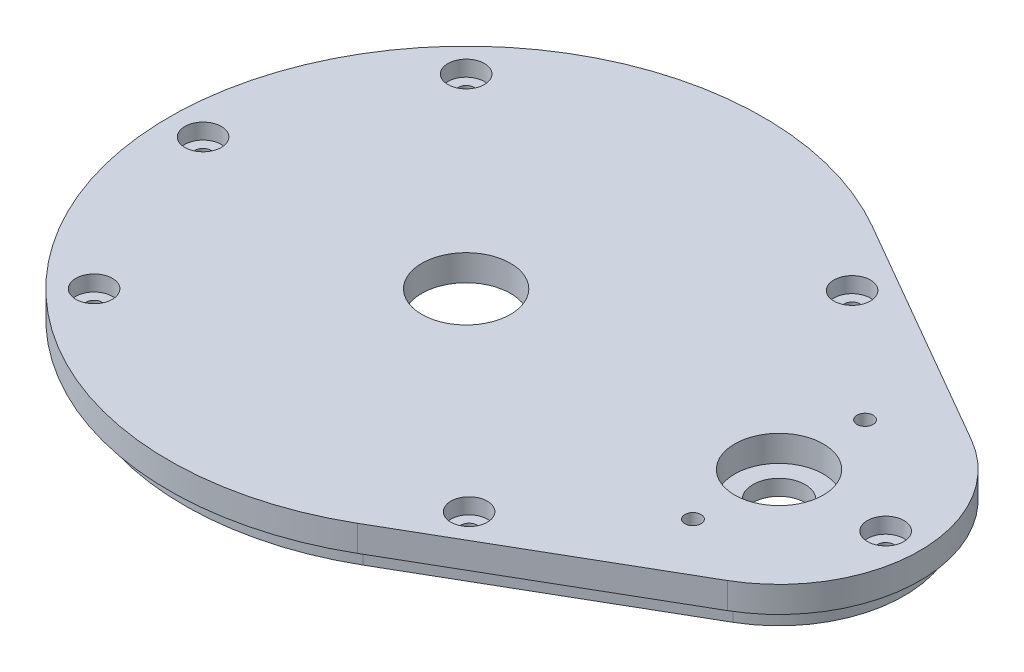
ISO-10303-21;
HEADER;
FILE_DESCRIPTION(('STEP AP214'),'2;1');
FILE_NAME('part.step','',(''),(''),'','','');
FILE_SCHEMA(('AUTOMOTIVE_DESIGN { 1 0 10303 214 1 1 1 1 }'));
ENDSEC;
DATA;
#1=APPLICATION_CONTEXT('core data for automotive mechanical design processes');
#2=APPLICATION_PROTOCOL_DEFINITION('international standard','automotive_design',2000,#1);
#3=PRODUCT_CONTEXT('',#1,'mechanical');
#4=PRODUCT('Part','Part','',(#3));
#5=PRODUCT_RELATED_PRODUCT_CATEGORY('part','',(#4));
#6=PRODUCT_DEFINITION_FORMATION('','',#4);
#7=PRODUCT_DEFINITION_CONTEXT('part definition',#1,'design');
#8=PRODUCT_DEFINITION('design','',#6,#7);
#9=PRODUCT_DEFINITION_SHAPE('','',#8);
#10=(LENGTH_UNIT() NAMED_UNIT(*) SI_UNIT(.MILLI.,.METRE.));
#11=(NAMED_UNIT(*) PLANE_ANGLE_UNIT() SI_UNIT($,.RADIAN.));
#12=(NAMED_UNIT(*) SI_UNIT($,.STERADIAN.) SOLID_ANGLE_UNIT());
#13=UNCERTAINTY_MEASURE_WITH_UNIT(LENGTH_MEASURE(1.E-05),#10,'distance_accuracy_value','');
#14=(GEOMETRIC_REPRESENTATION_CONTEXT(3) GLOBAL_UNCERTAINTY_ASSIGNED_CONTEXT((#13)) GLOBAL_UNIT_ASSIGNED_CONTEXT((#10,
#11,#12)) REPRESENTATION_CONTEXT('',''));
#15=CARTESIAN_POINT('',(0.,0.,0.));
#16=DIRECTION('',(0.,0.,1.));
#17=DIRECTION('',(1.,0.,0.));
#18=AXIS2_PLACEMENT_3D('',#15,#16,#17);
#19=CARTESIAN_POINT('',(22.2847401814526,0.,-36.7283111091591));
#20=DIRECTION('',(0.,1.,0.));
#21=DIRECTION('',(0.,0.,1.));
#22=AXIS2_PLACEMENT_3D('',#19,#20,#21);
#23=CYLINDRICAL_SURFACE('',#22,1.55);
#24=CARTESIAN_POINT('',(22.2847401814526,0.,-36.7283111091591));
#25=DIRECTION('',(0.,-1.,0.));
#26=DIRECTION('',(0.495533960302209,0.,-0.868588564388922));
#27=AXIS2_PLACEMENT_3D('',#24,#25,#26);
#28=CIRCLE('',#27,1.55);
#29=CARTESIAN_POINT('',(23.052817819921,0.,-38.074623383962));
#30=VERTEX_POINT('',#29);
#31=CARTESIAN_POINT('',(23.0666419936245,0.,-38.066641993553));
#32=VERTEX_POINT('',#31);
#33=EDGE_CURVE('E145',#30,#32,#28,.T.);
#34=ORIENTED_EDGE('',*,*,#33,.T.);
#35=CARTESIAN_POINT('',(22.2847401814526,0.,-36.7283111091591));
#36=DIRECTION('',(0.,1.,0.));
#37=DIRECTION('',(0.,0.,1.));
#38=AXIS2_PLACEMENT_3D('',#35,#36,#37);
#39=CIRCLE('',#38,1.55);
#40=EDGE_CURVE('E149',#30,#32,#39,.T.);
#41=ORIENTED_EDGE('',*,*,#40,.F.);
#42=EDGE_LOOP('',(#34,#41));
#43=FACE_BOUND('',#42,.T.);
#44=CARTESIAN_POINT('',(22.2847401814526,2.,-36.7283111091591));
#45=DIRECTION('',(0.,1.,0.));
#46=DIRECTION('',(0.,0.,1.));
#47=AXIS2_PLACEMENT_3D('',#44,#45,#46);
#48=CIRCLE('',#47,1.55);
#49=CARTESIAN_POINT('',(22.2847401814526,2.,-35.1783111091592));
#50=VERTEX_POINT('',#49);
#51=EDGE_CURVE('E40',#50,#50,#48,.F.);
#52=ORIENTED_EDGE('',*,*,#51,.F.);
#53=EDGE_LOOP('',(#52));
#54=FACE_BOUND('',#53,.T.);
#55=ADVANCED_FACE('F36',(#43,#54),#23,.F.);
#56=CARTESIAN_POINT('',(65.4499999999117,0.,0.));
#57=DIRECTION('',(0.,1.,0.));
#58=DIRECTION('',(0.,0.,1.));
#59=AXIS2_PLACEMENT_3D('',#56,#57,#58);
#60=CYLINDRICAL_SURFACE('',#59,1.55000000006846);
#61=CARTESIAN_POINT('',(65.4499999999117,0.,0.));
#62=DIRECTION('',(0.,1.,0.));
#63=DIRECTION('',(0.,0.,1.));
#64=AXIS2_PLACEMENT_3D('',#61,#62,#63);
#65=CIRCLE('',#64,1.55000000006846);
#66=CARTESIAN_POINT('',(66.9999999999117,0.,-6.12727402448547E-13));
#67=VERTEX_POINT('',#66);
#68=EDGE_CURVE('E432',#67,#67,#65,.T.);
#69=ORIENTED_EDGE('',*,*,#68,.F.);
#70=EDGE_LOOP('',(#69));
#71=FACE_BOUND('',#70,.T.);
#72=CARTESIAN_POINT('',(65.4499999999117,2.,0.));
#73=DIRECTION('',(0.,1.,0.));
#74=DIRECTION('',(0.,0.,1.));
#75=AXIS2_PLACEMENT_3D('',#72,#73,#74);
#76=CIRCLE('',#75,1.55000000006846);
#77=CARTESIAN_POINT('',(65.4499999999117,2.,1.55000000006846));
#78=VERTEX_POINT('',#77);
#79=EDGE_CURVE('E446',#78,#78,#76,.F.);
#80=ORIENTED_EDGE('',*,*,#79,.F.);
#81=EDGE_LOOP('',(#80));
#82=FACE_BOUND('',#81,.T.);
#83=ADVANCED_FACE('F391',(#71,#82),#60,.F.);
#84=CARTESIAN_POINT('',(-50.6735371108547,0.,35.6735371108691));
#85=DIRECTION('',(0.,1.,0.));
#86=DIRECTION('',(0.,0.,1.));
#87=AXIS2_PLACEMENT_3D('',#84,#85,#86);
#88=CYLINDRICAL_SURFACE('',#87,1.55);
#89=CARTESIAN_POINT('',(-50.6735371108547,0.,35.6735371108691));
#90=DIRECTION('',(0.,1.,0.));
#91=DIRECTION('',(0.,0.,1.));
#92=AXIS2_PLACEMENT_3D('',#89,#90,#91);
#93=CIRCLE('',#92,1.55);
#94=CARTESIAN_POINT('',(-51.7695526216938,0.,36.7695526217082));
#95=VERTEX_POINT('',#94);
#96=EDGE_CURVE('E165',#95,#95,#93,.T.);
#97=ORIENTED_EDGE('',*,*,#96,.F.);
#98=EDGE_LOOP('',(#97));
#99=FACE_BOUND('',#98,.T.);
#100=CARTESIAN_POINT('',(-50.6735371108547,2.,35.6735371108691));
#101=DIRECTION('',(0.,1.,0.));
#102=DIRECTION('',(0.,0.,1.));
#103=AXIS2_PLACEMENT_3D('',#100,#101,#102);
#104=CIRCLE('',#103,1.55);
#105=CARTESIAN_POINT('',(-50.6735371108547,2.,37.2235371108691));
#106=VERTEX_POINT('',#105);
#107=EDGE_CURVE('E450',#106,#106,#104,.F.);
#108=ORIENTED_EDGE('',*,*,#107,.F.);
#109=EDGE_LOOP('',(#108));
#110=FACE_BOUND('',#109,.T.);
#111=ADVANCED_FACE('F396',(#99,#110),#88,.F.);
#112=CARTESIAN_POINT('',(-50.6735371108711,0.,-35.6735371108371));
#113=DIRECTION('',(0.,1.,0.));
#114=DIRECTION('',(0.,0.,1.));
#115=AXIS2_PLACEMENT_3D('',#112,#113,#114);
#116=CYLINDRICAL_SURFACE('',#115,1.55);
#117=CARTESIAN_POINT('',(-50.6735371108711,0.,-35.6735371108371));
#118=DIRECTION('',(0.,1.,0.));
#119=DIRECTION('',(0.,0.,1.));
#120=AXIS2_PLACEMENT_3D('',#117,#118,#119);
#121=CIRCLE('',#120,1.55);
#122=CARTESIAN_POINT('',(-51.7695526217107,0.,-36.7695526216758));
#123=VERTEX_POINT('',#122);
#124=EDGE_CURVE('E51',#123,#123,#121,.T.);
#125=ORIENTED_EDGE('',*,*,#124,.F.);
#126=EDGE_LOOP('',(#125));
#127=FACE_BOUND('',#126,.T.);
#128=CARTESIAN_POINT('',(-50.6735371108711,2.,-35.6735371108371));
#129=DIRECTION('',(0.,1.,0.));
#130=DIRECTION('',(0.,0.,1.));
#131=AXIS2_PLACEMENT_3D('',#128,#129,#130);
#132=CIRCLE('',#131,1.55);
#133=CARTESIAN_POINT('',(-50.6735371108711,2.,-34.1235371108371));
#134=VERTEX_POINT('',#133);
#135=EDGE_CURVE('E454',#134,#134,#132,.F.);
#136=ORIENTED_EDGE('',*,*,#135,.F.);
#137=EDGE_LOOP('',(#136));
#138=FACE_BOUND('',#137,.T.);
#139=ADVANCED_FACE('F402',(#127,#138),#116,.F.);
#140=CARTESIAN_POINT('',(22.2916419935675,0.,36.7243026177355));
#141=DIRECTION('',(0.,1.,0.));
#142=DIRECTION('',(0.,0.,1.));
#143=AXIS2_PLACEMENT_3D('',#140,#141,#142);
#144=CYLINDRICAL_SURFACE('',#143,1.55);
#145=CARTESIAN_POINT('',(22.2916419935675,0.,36.7243026177355));
#146=DIRECTION('',(0.,1.,0.));
#147=DIRECTION('',(0.,0.,1.));
#148=AXIS2_PLACEMENT_3D('',#145,#146,#147);
#149=CIRCLE('',#148,1.55);
#150=CARTESIAN_POINT('',(23.0666419935675,0.,38.0666419936016));
#151=VERTEX_POINT('',#150);
#152=EDGE_CURVE('E438',#151,#151,#149,.T.);
#153=ORIENTED_EDGE('',*,*,#152,.F.);
#154=EDGE_LOOP('',(#153));
#155=FACE_BOUND('',#154,.T.);
#156=CARTESIAN_POINT('',(22.2916419935675,2.,36.7243026177355));
#157=DIRECTION('',(0.,1.,0.));
#158=DIRECTION('',(0.,0.,1.));
#159=AXIS2_PLACEMENT_3D('',#156,#157,#158);
#160=CIRCLE('',#159,1.55);
#161=CARTESIAN_POINT('',(22.2916419935675,2.,38.2743026177355));
#162=VERTEX_POINT('',#161);
#163=EDGE_CURVE('E458',#162,#162,#160,.F.);
#164=ORIENTED_EDGE('',*,*,#163,.F.);
#165=EDGE_LOOP('',(#164));
#166=FACE_BOUND('',#165,.T.);
#167=ADVANCED_FACE('F555',(#155,#166),#144,.F.);
#168=CARTESIAN_POINT('',(-65.4499999999934,0.,0.));
#169=DIRECTION('',(0.,1.,0.));
#170=DIRECTION('',(0.,0.,1.));
#171=AXIS2_PLACEMENT_3D('',#168,#169,#170);
#172=CYLINDRICAL_SURFACE('',#171,1.54999999999998);
#173=CARTESIAN_POINT('',(-65.4499999999934,0.,0.));
#174=DIRECTION('',(0.,1.,0.));
#175=DIRECTION('',(0.,0.,1.));
#176=AXIS2_PLACEMENT_3D('',#173,#174,#175);
#177=CIRCLE('',#176,1.54999999999998);
#178=CARTESIAN_POINT('',(-66.9999999999933,0.,-2.38500803895852E-13));
#179=VERTEX_POINT('',#178);
#180=EDGE_CURVE('E56',#179,#179,#177,.T.);
#181=ORIENTED_EDGE('',*,*,#180,.F.);
#182=EDGE_LOOP('',(#181));
#183=FACE_BOUND('',#182,.T.);
#184=CARTESIAN_POINT('',(-65.4499999999934,2.,0.));
#185=DIRECTION('',(0.,1.,0.));
#186=DIRECTION('',(0.,0.,1.));
#187=AXIS2_PLACEMENT_3D('',#184,#185,#186);
#188=CIRCLE('',#187,1.54999999999998);
#189=CARTESIAN_POINT('',(-65.4499999999934,2.,1.54999999999998));
#190=VERTEX_POINT('',#189);
#191=EDGE_CURVE('E180',#190,#190,#188,.F.);
#192=ORIENTED_EDGE('',*,*,#191,.F.);
#193=EDGE_LOOP('',(#192));
#194=FACE_BOUND('',#193,.T.);
#195=ADVANCED_FACE('F544',(#183,#194),#172,.F.);
#196=CARTESIAN_POINT('',(-14.9999999999933,0.,7.76281648809408E-12));
#197=DIRECTION('',(0.,1.,0.));
#198=DIRECTION('',(0.,0.,1.));
#199=AXIS2_PLACEMENT_3D('',#196,#197,#198);
#200=PLANE('',#199);
#201=CARTESIAN_POINT('',(-14.9999999999933,0.,7.76281648809408E-12));
#202=DIRECTION('',(0.,1.,0.));
#203=DIRECTION('',(0.,0.,1.));
#204=AXIS2_PLACEMENT_3D('',#201,#202,#203);
#205=CIRCLE('',#204,56.9999999999984);
#206=CARTESIAN_POINT('',(13.5000000000058,0.,-49.3634480157038));
#207=VERTEX_POINT('',#206);
#208=CARTESIAN_POINT('',(13.5000000000069,0.,49.3634480157188));
#209=VERTEX_POINT('',#208);
#210=EDGE_CURVE('E269',#207,#209,#205,.T.);
#211=ORIENTED_EDGE('',*,*,#210,.F.);
#212=DIRECTION('',(-0.866025403784433,0.,-0.500000000000009));
#213=VECTOR('',#212,1.);
#214=CARTESIAN_POINT('',(13.5000000000058,0.,-49.3634480157038));
#215=LINE('',#214,#213);
#216=CARTESIAN_POINT('',(58.4999999998629,0.,-23.3826859022526));
#217=VERTEX_POINT('',#216);
#218=EDGE_CURVE('E276',#217,#207,#215,.T.);
#219=ORIENTED_EDGE('',*,*,#218,.F.);
#220=CARTESIAN_POINT('',(44.9999999998162,0.,8.08674285530092E-12));
#221=DIRECTION('',(0.,1.,0.));
#222=DIRECTION('',(0.,0.,-1.));
#223=AXIS2_PLACEMENT_3D('',#220,#221,#222);
#224=CIRCLE('',#223,27.0000000000933);
#225=CARTESIAN_POINT('',(58.4999999998629,0.,23.3826859022687));
#226=VERTEX_POINT('',#225);
#227=EDGE_CURVE('E287',#226,#217,#224,.T.);
#228=ORIENTED_EDGE('',*,*,#227,.F.);
#229=DIRECTION('',(0.866025403784439,0.,-0.5));
#230=VECTOR('',#229,1.);
#231=CARTESIAN_POINT('',(13.5000000000069,0.,49.3634480157188));
#232=LINE('',#231,#230);
#233=EDGE_CURVE('E285',#209,#226,#232,.T.);
#234=ORIENTED_EDGE('',*,*,#233,.F.);
#235=EDGE_LOOP('',(#211,#219,#228,#234));
#236=FACE_BOUND('',#235,.T.);
#237=CARTESIAN_POINT('',(-14.9999999999933,0.,7.76281648809408E-12));
#238=DIRECTION('',(0.,-1.,0.));
#239=DIRECTION('',(0.,0.,-1.));
#240=AXIS2_PLACEMENT_3D('',#237,#238,#239);
#241=CIRCLE('',#240,54.);
#242=CARTESIAN_POINT('',(12.0000000000062,0.,46.7653718043677));
#243=VERTEX_POINT('',#242);
#244=CARTESIAN_POINT('',(12.0000000000067,0.,-46.7653718043519));
#245=VERTEX_POINT('',#244);
#246=EDGE_CURVE('E205',#243,#245,#241,.T.);
#247=ORIENTED_EDGE('',*,*,#246,.F.);
#248=DIRECTION('',(-0.866025403784444,0.,0.499999999999991));
#249=VECTOR('',#248,1.);
#250=CARTESIAN_POINT('',(12.0000000000062,0.,46.7653718043677));
#251=LINE('',#250,#249);
#252=CARTESIAN_POINT('',(56.9999999998638,0.,20.7846096909174));
#253=VERTEX_POINT('',#252);
#254=EDGE_CURVE('E210',#253,#243,#251,.T.);
#255=ORIENTED_EDGE('',*,*,#254,.F.);
#256=CARTESIAN_POINT('',(44.9999999998162,0.,8.08674285530092E-12));
#257=DIRECTION('',(0.,-1.,0.));
#258=DIRECTION('',(0.,0.,1.));
#259=AXIS2_PLACEMENT_3D('',#256,#257,#258);
#260=CIRCLE('',#259,24.0000000000955);
#261=CARTESIAN_POINT('',(56.999999999864,0.,-20.7846096909011));
#262=VERTEX_POINT('',#261);
#263=EDGE_CURVE('E222',#262,#253,#260,.T.);
#264=ORIENTED_EDGE('',*,*,#263,.F.);
#265=DIRECTION('',(0.866025403784438,0.,0.500000000000001));
#266=VECTOR('',#265,1.);
#267=CARTESIAN_POINT('',(12.0000000000067,0.,-46.7653718043519));
#268=LINE('',#267,#266);
#269=EDGE_CURVE('E219',#245,#262,#268,.T.);
#270=ORIENTED_EDGE('',*,*,#269,.F.);
#271=EDGE_LOOP('',(#247,#255,#264,#270));
#272=FACE_BOUND('',#271,.T.);
#273=ADVANCED_FACE('F373',(#236,#272),#200,.F.);
#274=CARTESIAN_POINT('',(-14.9999999999933,5.,7.76281648809408E-12));
#275=DIRECTION('',(0.,1.,0.));
#276=DIRECTION('',(0.,0.,1.));
#277=AXIS2_PLACEMENT_3D('',#274,#275,#276);
#278=PLANE('',#277);
#279=CARTESIAN_POINT('',(65.4499999999117,5.,0.));
#280=DIRECTION('',(0.,1.,0.));
#281=DIRECTION('',(0.,0.,1.));
#282=AXIS2_PLACEMENT_3D('',#279,#280,#281);
#283=CIRCLE('',#282,3.50000000000001);
#284=CARTESIAN_POINT('',(65.4499999999117,5.,3.50000000000001));
#285=VERTEX_POINT('',#284);
#286=EDGE_CURVE('E475',#285,#285,#283,.T.);
#287=ORIENTED_EDGE('',*,*,#286,.F.);
#288=EDGE_LOOP('',(#287));
#289=FACE_BOUND('',#288,.T.);
#290=CARTESIAN_POINT('',(22.2847401814526,5.,-36.7283111091591));
#291=DIRECTION('',(0.,1.,0.));
#292=DIRECTION('',(0.,0.,1.));
#293=AXIS2_PLACEMENT_3D('',#290,#291,#292);
#294=CIRCLE('',#293,3.5);
#295=CARTESIAN_POINT('',(22.2847401814526,5.,-33.2283111091591));
#296=VERTEX_POINT('',#295);
#297=EDGE_CURVE('E481',#296,#296,#294,.T.);
#298=ORIENTED_EDGE('',*,*,#297,.F.);
#299=EDGE_LOOP('',(#298));
#300=FACE_BOUND('',#299,.T.);
#301=CARTESIAN_POINT('',(22.2916419935675,5.,36.7243026177355));
#302=DIRECTION('',(0.,1.,0.));
#303=DIRECTION('',(0.,0.,1.));
#304=AXIS2_PLACEMENT_3D('',#301,#302,#303);
#305=CIRCLE('',#304,3.5);
#306=CARTESIAN_POINT('',(22.2916419935675,5.,40.2243026177355));
#307=VERTEX_POINT('',#306);
#308=EDGE_CURVE('E487',#307,#307,#305,.T.);
#309=ORIENTED_EDGE('',*,*,#308,.F.);
#310=EDGE_LOOP('',(#309));
#311=FACE_BOUND('',#310,.T.);
#312=CARTESIAN_POINT('',(-50.6735371108547,5.,35.6735371108691));
#313=DIRECTION('',(0.,1.,0.));
#314=DIRECTION('',(0.,0.,1.));
#315=AXIS2_PLACEMENT_3D('',#312,#313,#314);
#316=CIRCLE('',#315,3.5);
#317=CARTESIAN_POINT('',(-50.6735371108547,5.,39.1735371108691));
#318=VERTEX_POINT('',#317);
#319=EDGE_CURVE('E493',#318,#318,#316,.T.);
#320=ORIENTED_EDGE('',*,*,#319,.F.);
#321=EDGE_LOOP('',(#320));
#322=FACE_BOUND('',#321,.T.);
#323=CARTESIAN_POINT('',(-65.4499999999934,5.,0.));
#324=DIRECTION('',(0.,1.,0.));
#325=DIRECTION('',(0.,0.,1.));
#326=AXIS2_PLACEMENT_3D('',#323,#324,#325);
#327=CIRCLE('',#326,3.5);
#328=CARTESIAN_POINT('',(-65.4499999999934,5.,3.5));
#329=VERTEX_POINT('',#328);
#330=EDGE_CURVE('E499',#329,#329,#327,.T.);
#331=ORIENTED_EDGE('',*,*,#330,.F.);
#332=EDGE_LOOP('',(#331));
#333=FACE_BOUND('',#332,.T.);
#334=CARTESIAN_POINT('',(-50.6735371108711,5.,-35.6735371108371));
#335=DIRECTION('',(0.,1.,0.));
#336=DIRECTION('',(0.,0.,1.));
#337=AXIS2_PLACEMENT_3D('',#334,#335,#336);
#338=CIRCLE('',#337,3.5);
#339=CARTESIAN_POINT('',(-50.6735371108711,5.,-32.1735371108371));
#340=VERTEX_POINT('',#339);
#341=EDGE_CURVE('E467',#340,#340,#338,.T.);
#342=ORIENTED_EDGE('',*,*,#341,.F.);
#343=EDGE_LOOP('',(#342));
#344=FACE_BOUND('',#343,.T.);
#345=CARTESIAN_POINT('',(44.9999999998162,5.,-16.4999999999919));
#346=DIRECTION('',(0.,1.,0.));
#347=DIRECTION('',(0.,0.,1.));
#348=AXIS2_PLACEMENT_3D('',#345,#346,#347);
#349=CIRCLE('',#348,1.55000000017809);
#350=CARTESIAN_POINT('',(44.9999999998162,5.,-14.9499999998138));
#351=VERTEX_POINT('',#350);
#352=EDGE_CURVE('E254',#351,#351,#349,.T.);
#353=ORIENTED_EDGE('',*,*,#352,.F.);
#354=EDGE_LOOP('',(#353));
#355=FACE_BOUND('',#354,.T.);
#356=CARTESIAN_POINT('',(-14.9999999999933,5.,7.76281648809408E-12));
#357=DIRECTION('',(0.,1.,0.));
#358=DIRECTION('',(0.,0.,1.));
#359=AXIS2_PLACEMENT_3D('',#356,#357,#358);
#360=CIRCLE('',#359,8.5);
#361=CARTESIAN_POINT('',(-14.9999999999933,5.,8.50000000000776));
#362=VERTEX_POINT('',#361);
#363=EDGE_CURVE('E266',#362,#362,#360,.T.);
#364=ORIENTED_EDGE('',*,*,#363,.F.);
#365=EDGE_LOOP('',(#364));
#366=FACE_BOUND('',#365,.T.);
#367=CARTESIAN_POINT('',(-14.9999999999933,5.,7.76281648809408E-12));
#368=DIRECTION('',(0.,1.,0.));
#369=DIRECTION('',(0.,0.,1.));
#370=AXIS2_PLACEMENT_3D('',#367,#368,#369);
#371=CIRCLE('',#370,56.9999999999984);
#372=CARTESIAN_POINT('',(13.5000000000058,5.,-49.3634480157038));
#373=VERTEX_POINT('',#372);
#374=CARTESIAN_POINT('',(13.5000000000069,5.,49.3634480157188));
#375=VERTEX_POINT('',#374);
#376=EDGE_CURVE('E272',#373,#375,#371,.T.);
#377=ORIENTED_EDGE('',*,*,#376,.T.);
#378=DIRECTION('',(0.866025403784439,0.,-0.5));
#379=VECTOR('',#378,1.);
#380=CARTESIAN_POINT('',(13.5000000000069,5.,49.3634480157188));
#381=LINE('',#380,#379);
#382=CARTESIAN_POINT('',(58.4999999998629,5.,23.3826859022687));
#383=VERTEX_POINT('',#382);
#384=EDGE_CURVE('E275',#375,#383,#381,.T.);
#385=ORIENTED_EDGE('',*,*,#384,.T.);
#386=CARTESIAN_POINT('',(44.9999999998162,5.,8.08674285530092E-12));
#387=DIRECTION('',(0.,1.,0.));
#388=DIRECTION('',(0.,0.,-1.));
#389=AXIS2_PLACEMENT_3D('',#386,#387,#388);
#390=CIRCLE('',#389,27.0000000000933);
#391=CARTESIAN_POINT('',(58.4999999998629,5.,-23.3826859022526));
#392=VERTEX_POINT('',#391);
#393=EDGE_CURVE('E278',#383,#392,#390,.T.);
#394=ORIENTED_EDGE('',*,*,#393,.T.);
#395=DIRECTION('',(-0.866025403784433,0.,-0.500000000000009));
#396=VECTOR('',#395,1.);
#397=CARTESIAN_POINT('',(13.5000000000058,5.,-49.3634480157038));
#398=LINE('',#397,#396);
#399=EDGE_CURVE('E280',#392,#373,#398,.T.);
#400=ORIENTED_EDGE('',*,*,#399,.T.);
#401=EDGE_LOOP('',(#377,#385,#394,#400));
#402=FACE_BOUND('',#401,.T.);
#403=CARTESIAN_POINT('',(44.9999999998162,5.,8.08674285530092E-12));
#404=DIRECTION('',(0.,1.,0.));
#405=DIRECTION('',(0.,0.,1.));
#406=AXIS2_PLACEMENT_3D('',#403,#404,#405);
#407=CIRCLE('',#406,8.50000000008592);
#408=CARTESIAN_POINT('',(44.9999999998162,5.,8.50000000009401));
#409=VERTEX_POINT('',#408);
#410=EDGE_CURVE('E260',#409,#409,#407,.T.);
#411=ORIENTED_EDGE('',*,*,#410,.F.);
#412=EDGE_LOOP('',(#411));
#413=FACE_BOUND('',#412,.T.);
#414=CARTESIAN_POINT('',(44.9999999998162,5.,16.5000000000081));
#415=DIRECTION('',(0.,1.,0.));
#416=DIRECTION('',(0.,0.,1.));
#417=AXIS2_PLACEMENT_3D('',#414,#415,#416);
#418=CIRCLE('',#417,1.5500000001781);
#419=CARTESIAN_POINT('',(44.9999999998162,5.,18.0500000001862));
#420=VERTEX_POINT('',#419);
#421=EDGE_CURVE('E248',#420,#420,#418,.T.);
#422=ORIENTED_EDGE('',*,*,#421,.F.);
#423=EDGE_LOOP('',(#422));
#424=FACE_BOUND('',#423,.T.);
#425=ADVANCED_FACE('F370',(#289,#300,#311,#322,#333,#344,#355,#366,#402,#413,#424),#278,.T.);
#426=CARTESIAN_POINT('',(-14.9999999999933,0.,7.76281648809408E-12));
#427=DIRECTION('',(0.,-1.,0.));
#428=DIRECTION('',(0.,0.,1.));
#429=AXIS2_PLACEMENT_3D('',#426,#427,#428);
#430=CIRCLE('',#429,52.);
#431=EDGE_CURVE('E173',#95,#179,#430,.T.);
#432=ORIENTED_EDGE('',*,*,#431,.T.);
#433=ORIENTED_EDGE('',*,*,#180,.T.);
#434=EDGE_CURVE('E857',#179,#123,#430,.T.);
#435=ORIENTED_EDGE('',*,*,#434,.T.);
#436=ORIENTED_EDGE('',*,*,#124,.T.);
#437=CARTESIAN_POINT('',(11.0000000000067,0.,-45.0333209967831));
#438=VERTEX_POINT('',#437);
#439=EDGE_CURVE('E175',#123,#438,#430,.T.);
#440=ORIENTED_EDGE('',*,*,#439,.T.);
#441=DIRECTION('',(0.866025403784439,0.,0.5));
#442=VECTOR('',#441,1.);
#443=CARTESIAN_POINT('',(11.0000000000067,0.,-45.0333209967831));
#444=LINE('',#443,#442);
#445=EDGE_CURVE('E155',#438,#30,#444,.T.);
#446=ORIENTED_EDGE('',*,*,#445,.T.);
#447=ORIENTED_EDGE('',*,*,#40,.T.);
#448=CARTESIAN_POINT('',(55.999999999864,0.,-19.0525588833323));
#449=VERTEX_POINT('',#448);
#450=EDGE_CURVE('E156',#32,#449,#444,.T.);
#451=ORIENTED_EDGE('',*,*,#450,.T.);
#452=CARTESIAN_POINT('',(44.9999999998162,0.,8.08674285530092E-12));
#453=DIRECTION('',(0.,-1.,0.));
#454=DIRECTION('',(0.,0.,-1.));
#455=AXIS2_PLACEMENT_3D('',#452,#453,#454);
#456=CIRCLE('',#455,22.0000000000955);
#457=EDGE_CURVE('E185',#449,#67,#456,.T.);
#458=ORIENTED_EDGE('',*,*,#457,.T.);
#459=ORIENTED_EDGE('',*,*,#68,.T.);
#460=CARTESIAN_POINT('',(55.9999999998638,0.,19.0525588833486));
#461=VERTEX_POINT('',#460);
#462=EDGE_CURVE('E189',#67,#461,#456,.T.);
#463=ORIENTED_EDGE('',*,*,#462,.T.);
#464=DIRECTION('',(-0.866025403784444,0.,0.499999999999991));
#465=VECTOR('',#464,1.);
#466=CARTESIAN_POINT('',(11.0000000000062,0.,45.0333209967989));
#467=LINE('',#466,#465);
#468=EDGE_CURVE('E190',#461,#151,#467,.T.);
#469=ORIENTED_EDGE('',*,*,#468,.T.);
#470=ORIENTED_EDGE('',*,*,#152,.T.);
#471=CARTESIAN_POINT('',(11.0000000000062,0.,45.0333209967989));
#472=VERTEX_POINT('',#471);
#473=EDGE_CURVE('E188',#151,#472,#467,.T.);
#474=ORIENTED_EDGE('',*,*,#473,.T.);
#475=EDGE_CURVE('E170',#472,#95,#430,.T.);
#476=ORIENTED_EDGE('',*,*,#475,.T.);
#477=ORIENTED_EDGE('',*,*,#96,.T.);
#478=EDGE_LOOP('',(#432,#433,#435,#436,#440,#446,#447,#451,#458,#459,#463,#469,#470,#474,#476,#477));
#479=FACE_BOUND('',#478,.T.);
#480=CARTESIAN_POINT('',(44.9999999998162,0.,8.08674285530092E-12));
#481=DIRECTION('',(0.,1.,0.));
#482=DIRECTION('',(0.,0.,1.));
#483=AXIS2_PLACEMENT_3D('',#480,#481,#482);
#484=CIRCLE('',#483,12.0000000001734);
#485=CARTESIAN_POINT('',(44.9999999998162,0.,12.0000000001815));
#486=VERTEX_POINT('',#485);
#487=EDGE_CURVE('E11',#486,#486,#484,.F.);
#488=ORIENTED_EDGE('',*,*,#487,.F.);
#489=EDGE_LOOP('',(#488));
#490=FACE_BOUND('',#489,.T.);
#491=CARTESIAN_POINT('',(-14.9999999999933,0.,7.76281648809408E-12));
#492=DIRECTION('',(0.,1.,0.));
#493=DIRECTION('',(0.,0.,1.));
#494=AXIS2_PLACEMENT_3D('',#491,#492,#493);
#495=CIRCLE('',#494,8.5);
#496=CARTESIAN_POINT('',(-14.9999999999933,0.,8.50000000000776));
#497=VERTEX_POINT('',#496);
#498=EDGE_CURVE('E263',#497,#497,#495,.T.);
#499=ORIENTED_EDGE('',*,*,#498,.T.);
#500=EDGE_LOOP('',(#499));
#501=FACE_BOUND('',#500,.T.);
#502=CARTESIAN_POINT('',(44.9999999998162,0.,-16.4999999999919));
#503=DIRECTION('',(0.,1.,0.));
#504=DIRECTION('',(0.,0.,1.));
#505=AXIS2_PLACEMENT_3D('',#502,#503,#504);
#506=CIRCLE('',#505,1.55000000017809);
#507=CARTESIAN_POINT('',(44.9999999998162,0.,-14.9499999998138));
#508=VERTEX_POINT('',#507);
#509=EDGE_CURVE('E251',#508,#508,#506,.T.);
#510=ORIENTED_EDGE('',*,*,#509,.T.);
#511=EDGE_LOOP('',(#510));
#512=FACE_BOUND('',#511,.T.);
#513=CARTESIAN_POINT('',(44.9999999998162,0.,16.5000000000081));
#514=DIRECTION('',(0.,1.,0.));
#515=DIRECTION('',(0.,0.,1.));
#516=AXIS2_PLACEMENT_3D('',#513,#514,#515);
#517=CIRCLE('',#516,1.5500000001781);
#518=CARTESIAN_POINT('',(44.9999999998162,0.,18.0500000001862));
#519=VERTEX_POINT('',#518);
#520=EDGE_CURVE('E247',#519,#519,#517,.T.);
#521=ORIENTED_EDGE('',*,*,#520,.T.);
#522=EDGE_LOOP('',(#521));
#523=FACE_BOUND('',#522,.T.);
#524=ADVANCED_FACE('F161',(#479,#490,#501,#512,#523),#200,.F.);
#525=CARTESIAN_POINT('',(-14.9999999999933,5.,7.76281648809408E-12));
#526=DIRECTION('',(0.,-1.,0.));
#527=DIRECTION('',(0.,0.,-1.));
#528=AXIS2_PLACEMENT_3D('',#525,#526,#527);
#529=CYLINDRICAL_SURFACE('',#528,56.9999999999984);
#530=ORIENTED_EDGE('',*,*,#210,.T.);
#531=DIRECTION('',(0.,-1.,0.));
#532=VECTOR('',#531,1.);
#533=CARTESIAN_POINT('',(13.5000000000069,5.,49.3634480157188));
#534=LINE('',#533,#532);
#535=EDGE_CURVE('E45',#375,#209,#534,.T.);
#536=ORIENTED_EDGE('',*,*,#535,.F.);
#537=ORIENTED_EDGE('',*,*,#376,.F.);
#538=DIRECTION('',(0.,-1.,0.));
#539=VECTOR('',#538,1.);
#540=CARTESIAN_POINT('',(13.5000000000058,5.,-49.3634480157038));
#541=LINE('',#540,#539);
#542=EDGE_CURVE('E282',#373,#207,#541,.T.);
#543=ORIENTED_EDGE('',*,*,#542,.T.);
#544=EDGE_LOOP('',(#530,#536,#537,#543));
#545=FACE_BOUND('',#544,.T.);
#546=ADVANCED_FACE('F38',(#545),#529,.T.);
#547=CARTESIAN_POINT('',(13.5000000000069,5.,49.3634480157188));
#548=DIRECTION('',(-0.5,0.,-0.866025403784439));
#549=DIRECTION('',(-0.866025403784439,0.,0.5));
#550=AXIS2_PLACEMENT_3D('',#547,#548,#549);
#551=PLANE('',#550);
#552=ORIENTED_EDGE('',*,*,#233,.T.);
#553=DIRECTION('',(0.,-1.,0.));
#554=VECTOR('',#553,1.);
#555=CARTESIAN_POINT('',(58.4999999998629,5.,23.3826859022687));
#556=LINE('',#555,#554);
#557=EDGE_CURVE('E295',#383,#226,#556,.T.);
#558=ORIENTED_EDGE('',*,*,#557,.F.);
#559=ORIENTED_EDGE('',*,*,#384,.F.);
#560=ORIENTED_EDGE('',*,*,#535,.T.);
#561=EDGE_LOOP('',(#552,#558,#559,#560));
#562=FACE_BOUND('',#561,.T.);
#563=ADVANCED_FACE('F382',(#562),#551,.F.);
#564=CARTESIAN_POINT('',(44.9999999998162,5.,8.08674285530092E-12));
#565=DIRECTION('',(0.,-1.,0.));
#566=DIRECTION('',(0.,0.,-1.));
#567=AXIS2_PLACEMENT_3D('',#564,#565,#566);
#568=CYLINDRICAL_SURFACE('',#567,27.0000000000933);
#569=ORIENTED_EDGE('',*,*,#227,.T.);
#570=DIRECTION('',(0.,-1.,0.));
#571=VECTOR('',#570,1.);
#572=CARTESIAN_POINT('',(58.4999999998629,5.,-23.3826859022526));
#573=LINE('',#572,#571);
#574=EDGE_CURVE('E292',#392,#217,#573,.T.);
#575=ORIENTED_EDGE('',*,*,#574,.F.);
#576=ORIENTED_EDGE('',*,*,#393,.F.);
#577=ORIENTED_EDGE('',*,*,#557,.T.);
#578=EDGE_LOOP('',(#569,#575,#576,#577));
#579=FACE_BOUND('',#578,.T.);
#580=ADVANCED_FACE('F379',(#579),#568,.T.);
#581=CARTESIAN_POINT('',(13.5000000000058,5.,-49.3634480157038));
#582=DIRECTION('',(-0.500000000000009,0.,0.866025403784433));
#583=DIRECTION('',(0.866025403784433,0.,0.500000000000009));
#584=AXIS2_PLACEMENT_3D('',#581,#582,#583);
#585=PLANE('',#584);
#586=ORIENTED_EDGE('',*,*,#218,.T.);
#587=ORIENTED_EDGE('',*,*,#542,.F.);
#588=ORIENTED_EDGE('',*,*,#399,.F.);
#589=ORIENTED_EDGE('',*,*,#574,.T.);
#590=EDGE_LOOP('',(#586,#587,#588,#589));
#591=FACE_BOUND('',#590,.T.);
#592=ADVANCED_FACE('F368',(#591),#585,.F.);
#593=CARTESIAN_POINT('',(-14.9999999999933,5.,7.76281648809408E-12));
#594=DIRECTION('',(0.,-1.,0.));
#595=DIRECTION('',(0.,0.,-1.));
#596=AXIS2_PLACEMENT_3D('',#593,#594,#595);
#597=CYLINDRICAL_SURFACE('',#596,8.5);
#598=ORIENTED_EDGE('',*,*,#363,.T.);
#599=EDGE_LOOP('',(#598));
#600=FACE_BOUND('',#599,.T.);
#601=ORIENTED_EDGE('',*,*,#498,.F.);
#602=EDGE_LOOP('',(#601));
#603=FACE_BOUND('',#602,.T.);
#604=ADVANCED_FACE('F364',(#600,#603),#597,.F.);
#605=CARTESIAN_POINT('',(44.9999999998162,5.,8.08674285530092E-12));
#606=DIRECTION('',(0.,-1.,0.));
#607=DIRECTION('',(0.,0.,-1.));
#608=AXIS2_PLACEMENT_3D('',#605,#606,#607);
#609=CYLINDRICAL_SURFACE('',#608,8.50000000008592);
#610=ORIENTED_EDGE('',*,*,#410,.T.);
#611=EDGE_LOOP('',(#610));
#612=FACE_BOUND('',#611,.T.);
#613=CARTESIAN_POINT('',(44.9999999998162,0.,8.08674285530092E-12));
#614=DIRECTION('',(0.,1.,0.));
#615=DIRECTION('',(0.,0.,1.));
#616=AXIS2_PLACEMENT_3D('',#613,#614,#615);
#617=CIRCLE('',#616,8.50000000008592);
#618=CARTESIAN_POINT('',(44.9999999998162,0.,8.50000000009401));
#619=VERTEX_POINT('',#618);
#620=EDGE_CURVE('E257',#619,#619,#617,.T.);
#621=ORIENTED_EDGE('',*,*,#620,.F.);
#622=EDGE_LOOP('',(#621));
#623=FACE_BOUND('',#622,.T.);
#624=ADVANCED_FACE('F360',(#612,#623),#609,.F.);
#625=CARTESIAN_POINT('',(44.9999999998162,5.,-16.4999999999919));
#626=DIRECTION('',(0.,-1.,0.));
#627=DIRECTION('',(0.,0.,-1.));
#628=AXIS2_PLACEMENT_3D('',#625,#626,#627);
#629=CYLINDRICAL_SURFACE('',#628,1.55000000017809);
#630=ORIENTED_EDGE('',*,*,#352,.T.);
#631=EDGE_LOOP('',(#630));
#632=FACE_BOUND('',#631,.T.);
#633=ORIENTED_EDGE('',*,*,#509,.F.);
#634=EDGE_LOOP('',(#633));
#635=FACE_BOUND('',#634,.T.);
#636=ADVANCED_FACE('F356',(#632,#635),#629,.F.);
#637=CARTESIAN_POINT('',(44.9999999998162,5.,16.5000000000081));
#638=DIRECTION('',(0.,-1.,0.));
#639=DIRECTION('',(0.,0.,-1.));
#640=AXIS2_PLACEMENT_3D('',#637,#638,#639);
#641=CYLINDRICAL_SURFACE('',#640,1.5500000001781);
#642=ORIENTED_EDGE('',*,*,#421,.T.);
#643=EDGE_LOOP('',(#642));
#644=FACE_BOUND('',#643,.T.);
#645=ORIENTED_EDGE('',*,*,#520,.F.);
#646=EDGE_LOOP('',(#645));
#647=FACE_BOUND('',#646,.T.);
#648=ADVANCED_FACE('F349',(#644,#647),#641,.F.);
#649=CARTESIAN_POINT('',(44.9999999998162,0.,8.08674285530092E-12));
#650=DIRECTION('',(0.,-1.,0.));
#651=DIRECTION('',(0.,0.,-1.));
#652=AXIS2_PLACEMENT_3D('',#649,#650,#651);
#653=PLANE('',#652);
#654=CARTESIAN_POINT('',(44.9999999998162,0.,8.08674285530092E-12));
#655=DIRECTION('',(0.,-1.,0.));
#656=DIRECTION('',(0.,0.,-1.));
#657=AXIS2_PLACEMENT_3D('',#654,#655,#656);
#658=CIRCLE('',#657,5.00000000017337);
#659=CARTESIAN_POINT('',(44.9999999998162,0.,-5.00000000016528));
#660=VERTEX_POINT('',#659);
#661=EDGE_CURVE('E238',#660,#660,#658,.T.);
#662=ORIENTED_EDGE('',*,*,#661,.T.);
#663=EDGE_LOOP('',(#662));
#664=FACE_BOUND('',#663,.T.);
#665=ORIENTED_EDGE('',*,*,#620,.T.);
#666=EDGE_LOOP('',(#665));
#667=FACE_BOUND('',#666,.T.);
#668=ADVANCED_FACE('F345',(#664,#667),#653,.F.);
#669=CARTESIAN_POINT('',(44.9999999998162,-3.,8.08674285530092E-12));
#670=DIRECTION('',(0.,-1.,0.));
#671=DIRECTION('',(0.,0.,-1.));
#672=AXIS2_PLACEMENT_3D('',#669,#670,#671);
#673=PLANE('',#672);
#674=CARTESIAN_POINT('',(44.9999999998162,-3.,8.08674285530092E-12));
#675=DIRECTION('',(0.,-1.,0.));
#676=DIRECTION('',(0.,0.,-1.));
#677=AXIS2_PLACEMENT_3D('',#674,#675,#676);
#678=CIRCLE('',#677,12.0000000001734);
#679=CARTESIAN_POINT('',(44.9999999998162,-3.,-12.0000000001653));
#680=VERTEX_POINT('',#679);
#681=EDGE_CURVE('E242',#680,#680,#678,.T.);
#682=ORIENTED_EDGE('',*,*,#681,.T.);
#683=EDGE_LOOP('',(#682));
#684=FACE_BOUND('',#683,.T.);
#685=CARTESIAN_POINT('',(44.9999999998162,-3.,8.08674285530092E-12));
#686=DIRECTION('',(0.,-1.,0.));
#687=DIRECTION('',(0.,0.,-1.));
#688=AXIS2_PLACEMENT_3D('',#685,#686,#687);
#689=CIRCLE('',#688,5.00000000017337);
#690=CARTESIAN_POINT('',(44.9999999998162,-3.,-5.00000000016528));
#691=VERTEX_POINT('',#690);
#692=EDGE_CURVE('E239',#691,#691,#689,.T.);
#693=ORIENTED_EDGE('',*,*,#692,.F.);
#694=EDGE_LOOP('',(#693));
#695=FACE_BOUND('',#694,.T.);
#696=ADVANCED_FACE('F342',(#684,#695),#673,.T.);
#697=CARTESIAN_POINT('',(44.9999999998162,-3.,8.08674285530092E-12));
#698=DIRECTION('',(0.,1.,0.));
#699=DIRECTION('',(0.,0.,1.));
#700=AXIS2_PLACEMENT_3D('',#697,#698,#699);
#701=CYLINDRICAL_SURFACE('',#700,12.0000000001734);
#702=ORIENTED_EDGE('',*,*,#681,.F.);
#703=EDGE_LOOP('',(#702));
#704=FACE_BOUND('',#703,.T.);
#705=ORIENTED_EDGE('',*,*,#487,.T.);
#706=EDGE_LOOP('',(#705));
#707=FACE_BOUND('',#706,.T.);
#708=ADVANCED_FACE('F340',(#704,#707),#701,.T.);
#709=CARTESIAN_POINT('',(44.9999999998162,-3.,8.08674285530092E-12));
#710=DIRECTION('',(0.,1.,0.));
#711=DIRECTION('',(0.,0.,1.));
#712=AXIS2_PLACEMENT_3D('',#709,#710,#711);
#713=CYLINDRICAL_SURFACE('',#712,5.00000000017337);
#714=ORIENTED_EDGE('',*,*,#692,.T.);
#715=EDGE_LOOP('',(#714));
#716=FACE_BOUND('',#715,.T.);
#717=ORIENTED_EDGE('',*,*,#661,.F.);
#718=EDGE_LOOP('',(#717));
#719=FACE_BOUND('',#718,.T.);
#720=ADVANCED_FACE('F322',(#716,#719),#713,.F.);
#721=CARTESIAN_POINT('',(-14.9999999999933,-4.,7.76281648809408E-12));
#722=DIRECTION('',(0.,-1.,0.));
#723=DIRECTION('',(0.,0.,-1.));
#724=AXIS2_PLACEMENT_3D('',#721,#722,#723);
#725=PLANE('',#724);
#726=CARTESIAN_POINT('',(-14.9999999999933,-4.,7.76281648809408E-12));
#727=DIRECTION('',(0.,-1.,0.));
#728=DIRECTION('',(0.,0.,-1.));
#729=AXIS2_PLACEMENT_3D('',#726,#727,#728);
#730=CIRCLE('',#729,54.);
#731=CARTESIAN_POINT('',(12.0000000000062,-4.,46.7653718043677));
#732=VERTEX_POINT('',#731);
#733=CARTESIAN_POINT('',(12.0000000000067,-4.,-46.7653718043519));
#734=VERTEX_POINT('',#733);
#735=EDGE_CURVE('E206',#732,#734,#730,.T.);
#736=ORIENTED_EDGE('',*,*,#735,.T.);
#737=DIRECTION('',(0.866025403784438,0.,0.500000000000001));
#738=VECTOR('',#737,1.);
#739=CARTESIAN_POINT('',(12.0000000000067,-4.,-46.7653718043519));
#740=LINE('',#739,#738);
#741=CARTESIAN_POINT('',(56.999999999864,-4.,-20.7846096909011));
#742=VERTEX_POINT('',#741);
#743=EDGE_CURVE('E209',#734,#742,#740,.T.);
#744=ORIENTED_EDGE('',*,*,#743,.T.);
#745=CARTESIAN_POINT('',(44.9999999998162,-4.,8.08674285530092E-12));
#746=DIRECTION('',(0.,-1.,0.));
#747=DIRECTION('',(0.,0.,1.));
#748=AXIS2_PLACEMENT_3D('',#745,#746,#747);
#749=CIRCLE('',#748,24.0000000000955);
#750=CARTESIAN_POINT('',(56.9999999998638,-4.,20.7846096909174));
#751=VERTEX_POINT('',#750);
#752=EDGE_CURVE('E212',#742,#751,#749,.T.);
#753=ORIENTED_EDGE('',*,*,#752,.T.);
#754=DIRECTION('',(-0.866025403784444,0.,0.499999999999991));
#755=VECTOR('',#754,1.);
#756=CARTESIAN_POINT('',(12.0000000000062,-4.,46.7653718043677));
#757=LINE('',#756,#755);
#758=EDGE_CURVE('E214',#751,#732,#757,.T.);
#759=ORIENTED_EDGE('',*,*,#758,.T.);
#760=EDGE_LOOP('',(#736,#744,#753,#759));
#761=FACE_BOUND('',#760,.T.);
#762=DIRECTION('',(0.866025403784439,0.,0.5));
#763=VECTOR('',#762,1.);
#764=CARTESIAN_POINT('',(11.0000000000067,-4.,-45.0333209967831));
#765=LINE('',#764,#763);
#766=CARTESIAN_POINT('',(11.0000000000067,-4.,-45.0333209967831));
#767=VERTEX_POINT('',#766);
#768=CARTESIAN_POINT('',(55.999999999864,-4.,-19.0525588833323));
#769=VERTEX_POINT('',#768);
#770=EDGE_CURVE('E412',#767,#769,#765,.T.);
#771=ORIENTED_EDGE('',*,*,#770,.F.);
#772=CARTESIAN_POINT('',(-14.9999999999933,-4.,7.76281648809408E-12));
#773=DIRECTION('',(0.,-1.,0.));
#774=DIRECTION('',(0.,0.,1.));
#775=AXIS2_PLACEMENT_3D('',#772,#773,#774);
#776=CIRCLE('',#775,52.);
#777=CARTESIAN_POINT('',(11.0000000000062,-4.,45.0333209967989));
#778=VERTEX_POINT('',#777);
#779=EDGE_CURVE('E193',#778,#767,#776,.T.);
#780=ORIENTED_EDGE('',*,*,#779,.F.);
#781=DIRECTION('',(-0.866025403784444,0.,0.499999999999991));
#782=VECTOR('',#781,1.);
#783=CARTESIAN_POINT('',(11.0000000000062,-4.,45.0333209967989));
#784=LINE('',#783,#782);
#785=CARTESIAN_POINT('',(55.9999999998638,-4.,19.0525588833486));
#786=VERTEX_POINT('',#785);
#787=EDGE_CURVE('E198',#786,#778,#784,.T.);
#788=ORIENTED_EDGE('',*,*,#787,.F.);
#789=CARTESIAN_POINT('',(44.9999999998162,-4.,8.08674285530092E-12));
#790=DIRECTION('',(0.,-1.,0.));
#791=DIRECTION('',(0.,0.,-1.));
#792=AXIS2_PLACEMENT_3D('',#789,#790,#791);
#793=CIRCLE('',#792,22.0000000000955);
#794=EDGE_CURVE('E414',#769,#786,#793,.T.);
#795=ORIENTED_EDGE('',*,*,#794,.F.);
#796=EDGE_LOOP('',(#771,#780,#788,#795));
#797=FACE_BOUND('',#796,.T.);
#798=ADVANCED_FACE('F318',(#761,#797),#725,.T.);
#799=CARTESIAN_POINT('',(-14.9999999999933,-4.,7.76281648809408E-12));
#800=DIRECTION('',(0.,1.,0.));
#801=DIRECTION('',(0.,0.,1.));
#802=AXIS2_PLACEMENT_3D('',#799,#800,#801);
#803=CYLINDRICAL_SURFACE('',#802,54.);
#804=ORIENTED_EDGE('',*,*,#246,.T.);
#805=DIRECTION('',(0.,1.,0.));
#806=VECTOR('',#805,1.);
#807=CARTESIAN_POINT('',(12.0000000000067,-4.,-46.7653718043519));
#808=LINE('',#807,#806);
#809=EDGE_CURVE('E235',#734,#245,#808,.T.);
#810=ORIENTED_EDGE('',*,*,#809,.F.);
#811=ORIENTED_EDGE('',*,*,#735,.F.);
#812=DIRECTION('',(0.,1.,0.));
#813=VECTOR('',#812,1.);
#814=CARTESIAN_POINT('',(12.0000000000062,-4.,46.7653718043677));
#815=LINE('',#814,#813);
#816=EDGE_CURVE('E216',#732,#243,#815,.T.);
#817=ORIENTED_EDGE('',*,*,#816,.T.);
#818=EDGE_LOOP('',(#804,#810,#811,#817));
#819=FACE_BOUND('',#818,.T.);
#820=ADVANCED_FACE('F321',(#819),#803,.T.);
#821=CARTESIAN_POINT('',(12.0000000000067,-4.,-46.7653718043519));
#822=DIRECTION('',(-0.500000000000001,0.,0.866025403784438));
#823=DIRECTION('',(0.866025403784438,0.,0.500000000000001));
#824=AXIS2_PLACEMENT_3D('',#821,#822,#823);
#825=PLANE('',#824);
#826=ORIENTED_EDGE('',*,*,#269,.T.);
#827=DIRECTION('',(0.,1.,0.));
#828=VECTOR('',#827,1.);
#829=CARTESIAN_POINT('',(56.999999999864,-4.,-20.7846096909011));
#830=LINE('',#829,#828);
#831=EDGE_CURVE('E232',#742,#262,#830,.T.);
#832=ORIENTED_EDGE('',*,*,#831,.F.);
#833=ORIENTED_EDGE('',*,*,#743,.F.);
#834=ORIENTED_EDGE('',*,*,#809,.T.);
#835=EDGE_LOOP('',(#826,#832,#833,#834));
#836=FACE_BOUND('',#835,.T.);
#837=ADVANCED_FACE('F330',(#836),#825,.F.);
#838=CARTESIAN_POINT('',(44.9999999998162,-4.,8.08674285530092E-12));
#839=DIRECTION('',(0.,1.,0.));
#840=DIRECTION('',(0.,0.,1.));
#841=AXIS2_PLACEMENT_3D('',#838,#839,#840);
#842=CYLINDRICAL_SURFACE('',#841,24.0000000000955);
#843=ORIENTED_EDGE('',*,*,#263,.T.);
#844=DIRECTION('',(0.,1.,0.));
#845=VECTOR('',#844,1.);
#846=CARTESIAN_POINT('',(56.9999999998638,-4.,20.7846096909174));
#847=LINE('',#846,#845);
#848=EDGE_CURVE('E229',#751,#253,#847,.T.);
#849=ORIENTED_EDGE('',*,*,#848,.F.);
#850=ORIENTED_EDGE('',*,*,#752,.F.);
#851=ORIENTED_EDGE('',*,*,#831,.T.);
#852=EDGE_LOOP('',(#843,#849,#850,#851));
#853=FACE_BOUND('',#852,.T.);
#854=ADVANCED_FACE('F326',(#853),#842,.T.);
#855=CARTESIAN_POINT('',(12.0000000000062,-4.,46.7653718043677));
#856=DIRECTION('',(-0.499999999999991,0.,-0.866025403784444));
#857=DIRECTION('',(-0.866025403784444,0.,0.499999999999991));
#858=AXIS2_PLACEMENT_3D('',#855,#856,#857);
#859=PLANE('',#858);
#860=ORIENTED_EDGE('',*,*,#254,.T.);
#861=ORIENTED_EDGE('',*,*,#816,.F.);
#862=ORIENTED_EDGE('',*,*,#758,.F.);
#863=ORIENTED_EDGE('',*,*,#848,.T.);
#864=EDGE_LOOP('',(#860,#861,#862,#863));
#865=FACE_BOUND('',#864,.T.);
#866=ADVANCED_FACE('F316',(#865),#859,.F.);
#867=CARTESIAN_POINT('',(-14.9999999999933,-4.,7.76281648809408E-12));
#868=DIRECTION('',(0.,1.,0.));
#869=DIRECTION('',(0.,0.,1.));
#870=AXIS2_PLACEMENT_3D('',#867,#868,#869);
#871=CYLINDRICAL_SURFACE('',#870,52.);
#872=ORIENTED_EDGE('',*,*,#475,.F.);
#873=DIRECTION('',(0.,1.,0.));
#874=VECTOR('',#873,1.);
#875=CARTESIAN_POINT('',(11.0000000000062,-4.,45.0333209967989));
#876=LINE('',#875,#874);
#877=EDGE_CURVE('E194',#778,#472,#876,.T.);
#878=ORIENTED_EDGE('',*,*,#877,.F.);
#879=ORIENTED_EDGE('',*,*,#779,.T.);
#880=DIRECTION('',(0.,1.,0.));
#881=VECTOR('',#880,1.);
#882=CARTESIAN_POINT('',(11.0000000000067,-4.,-45.0333209967831));
#883=LINE('',#882,#881);
#884=EDGE_CURVE('E202',#767,#438,#883,.T.);
#885=ORIENTED_EDGE('',*,*,#884,.T.);
#886=ORIENTED_EDGE('',*,*,#439,.F.);
#887=ORIENTED_EDGE('',*,*,#434,.F.);
#888=ORIENTED_EDGE('',*,*,#431,.F.);
#889=EDGE_LOOP('',(#872,#878,#879,#885,#886,#887,#888));
#890=FACE_BOUND('',#889,.T.);
#891=ADVANCED_FACE('F312',(#890),#871,.F.);
#892=CARTESIAN_POINT('',(11.0000000000067,-4.,-45.0333209967831));
#893=DIRECTION('',(-0.5,0.,0.866025403784439));
#894=DIRECTION('',(0.866025403784439,0.,0.5));
#895=AXIS2_PLACEMENT_3D('',#892,#893,#894);
#896=PLANE('',#895);
#897=ORIENTED_EDGE('',*,*,#445,.F.);
#898=ORIENTED_EDGE('',*,*,#884,.F.);
#899=ORIENTED_EDGE('',*,*,#770,.T.);
#900=DIRECTION('',(0.,1.,0.));
#901=VECTOR('',#900,1.);
#902=CARTESIAN_POINT('',(55.999999999864,-4.,-19.0525588833323));
#903=LINE('',#902,#901);
#904=EDGE_CURVE('E168',#769,#449,#903,.T.);
#905=ORIENTED_EDGE('',*,*,#904,.T.);
#906=ORIENTED_EDGE('',*,*,#450,.F.);
#907=ORIENTED_EDGE('',*,*,#33,.F.);
#908=EDGE_LOOP('',(#897,#898,#899,#905,#906,#907));
#909=FACE_BOUND('',#908,.T.);
#910=ADVANCED_FACE('F166',(#909),#896,.T.);
#911=CARTESIAN_POINT('',(44.9999999998162,-4.,8.08674285530092E-12));
#912=DIRECTION('',(0.,1.,0.));
#913=DIRECTION('',(0.,0.,1.));
#914=AXIS2_PLACEMENT_3D('',#911,#912,#913);
#915=CYLINDRICAL_SURFACE('',#914,22.0000000000955);
#916=ORIENTED_EDGE('',*,*,#457,.F.);
#917=ORIENTED_EDGE('',*,*,#904,.F.);
#918=ORIENTED_EDGE('',*,*,#794,.T.);
#919=DIRECTION('',(0.,1.,0.));
#920=VECTOR('',#919,1.);
#921=CARTESIAN_POINT('',(55.9999999998638,-4.,19.0525588833486));
#922=LINE('',#921,#920);
#923=EDGE_CURVE('E197',#786,#461,#922,.T.);
#924=ORIENTED_EDGE('',*,*,#923,.T.);
#925=ORIENTED_EDGE('',*,*,#462,.F.);
#926=EDGE_LOOP('',(#916,#917,#918,#924,#925));
#927=FACE_BOUND('',#926,.T.);
#928=ADVANCED_FACE('F311',(#927),#915,.F.);
#929=CARTESIAN_POINT('',(11.0000000000062,-4.,45.0333209967989));
#930=DIRECTION('',(-0.499999999999991,0.,-0.866025403784444));
#931=DIRECTION('',(-0.866025403784444,0.,0.499999999999991));
#932=AXIS2_PLACEMENT_3D('',#929,#930,#931);
#933=PLANE('',#932);
#934=ORIENTED_EDGE('',*,*,#468,.F.);
#935=ORIENTED_EDGE('',*,*,#923,.F.);
#936=ORIENTED_EDGE('',*,*,#787,.T.);
#937=ORIENTED_EDGE('',*,*,#877,.T.);
#938=ORIENTED_EDGE('',*,*,#473,.F.);
#939=EDGE_LOOP('',(#934,#935,#936,#937,#938));
#940=FACE_BOUND('',#939,.T.);
#941=ADVANCED_FACE('F420',(#940),#933,.T.);
#942=CARTESIAN_POINT('',(-65.4499999999934,2.,0.));
#943=DIRECTION('',(0.,1.,0.));
#944=DIRECTION('',(0.,0.,1.));
#945=AXIS2_PLACEMENT_3D('',#942,#943,#944);
#946=PLANE('',#945);
#947=CARTESIAN_POINT('',(-65.4499999999934,2.,0.));
#948=DIRECTION('',(0.,1.,0.));
#949=DIRECTION('',(0.,0.,1.));
#950=AXIS2_PLACEMENT_3D('',#947,#948,#949);
#951=CIRCLE('',#950,3.5);
#952=CARTESIAN_POINT('',(-65.4499999999934,2.,3.5));
#953=VERTEX_POINT('',#952);
#954=EDGE_CURVE('E472',#953,#953,#951,.T.);
#955=ORIENTED_EDGE('',*,*,#954,.T.);
#956=EDGE_LOOP('',(#955));
#957=FACE_BOUND('',#956,.T.);
#958=ORIENTED_EDGE('',*,*,#191,.T.);
#959=EDGE_LOOP('',(#958));
#960=FACE_BOUND('',#959,.T.);
#961=ADVANCED_FACE('F505',(#957,#960),#946,.T.);
#962=CARTESIAN_POINT('',(-65.4499999999934,2.,0.));
#963=DIRECTION('',(0.,1.,0.));
#964=DIRECTION('',(0.,0.,1.));
#965=AXIS2_PLACEMENT_3D('',#962,#963,#964);
#966=CYLINDRICAL_SURFACE('',#965,3.5);
#967=ORIENTED_EDGE('',*,*,#954,.F.);
#968=EDGE_LOOP('',(#967));
#969=FACE_BOUND('',#968,.T.);
#970=ORIENTED_EDGE('',*,*,#330,.T.);
#971=EDGE_LOOP('',(#970));
#972=FACE_BOUND('',#971,.T.);
#973=ADVANCED_FACE('F507',(#969,#972),#966,.F.);
#974=CARTESIAN_POINT('',(22.2916419935675,2.,36.7243026177355));
#975=DIRECTION('',(0.,1.,0.));
#976=DIRECTION('',(0.,0.,1.));
#977=AXIS2_PLACEMENT_3D('',#974,#975,#976);
#978=PLANE('',#977);
#979=CARTESIAN_POINT('',(22.2916419935675,2.,36.7243026177355));
#980=DIRECTION('',(0.,1.,0.));
#981=DIRECTION('',(0.,0.,1.));
#982=AXIS2_PLACEMENT_3D('',#979,#980,#981);
#983=CIRCLE('',#982,3.5);
#984=CARTESIAN_POINT('',(22.2916419935675,2.,40.2243026177355));
#985=VERTEX_POINT('',#984);
#986=EDGE_CURVE('E490',#985,#985,#983,.T.);
#987=ORIENTED_EDGE('',*,*,#986,.T.);
#988=EDGE_LOOP('',(#987));
#989=FACE_BOUND('',#988,.T.);
#990=ORIENTED_EDGE('',*,*,#163,.T.);
#991=EDGE_LOOP('',(#990));
#992=FACE_BOUND('',#991,.T.);
#993=ADVANCED_FACE('F510',(#989,#992),#978,.T.);
#994=CARTESIAN_POINT('',(22.2916419935675,2.,36.7243026177355));
#995=DIRECTION('',(0.,1.,0.));
#996=DIRECTION('',(0.,0.,1.));
#997=AXIS2_PLACEMENT_3D('',#994,#995,#996);
#998=CYLINDRICAL_SURFACE('',#997,3.5);
#999=ORIENTED_EDGE('',*,*,#986,.F.);
#1000=EDGE_LOOP('',(#999));
#1001=FACE_BOUND('',#1000,.T.);
#1002=ORIENTED_EDGE('',*,*,#308,.T.);
#1003=EDGE_LOOP('',(#1002));
#1004=FACE_BOUND('',#1003,.T.);
#1005=ADVANCED_FACE('F572',(#1001,#1004),#998,.F.);
#1006=CARTESIAN_POINT('',(-50.6735371108711,2.,-35.6735371108371));
#1007=DIRECTION('',(0.,1.,0.));
#1008=DIRECTION('',(0.,0.,1.));
#1009=AXIS2_PLACEMENT_3D('',#1006,#1007,#1008);
#1010=PLANE('',#1009);
#1011=CARTESIAN_POINT('',(-50.6735371108711,2.,-35.6735371108371));
#1012=DIRECTION('',(0.,1.,0.));
#1013=DIRECTION('',(0.,0.,1.));
#1014=AXIS2_PLACEMENT_3D('',#1011,#1012,#1013);
#1015=CIRCLE('',#1014,3.5);
#1016=CARTESIAN_POINT('',(-50.6735371108711,2.,-32.1735371108371));
#1017=VERTEX_POINT('',#1016);
#1018=EDGE_CURVE('E463',#1017,#1017,#1015,.T.);
#1019=ORIENTED_EDGE('',*,*,#1018,.T.);
#1020=EDGE_LOOP('',(#1019));
#1021=FACE_BOUND('',#1020,.T.);
#1022=ORIENTED_EDGE('',*,*,#135,.T.);
#1023=EDGE_LOOP('',(#1022));
#1024=FACE_BOUND('',#1023,.T.);
#1025=ADVANCED_FACE('F568',(#1021,#1024),#1010,.T.);
#1026=CARTESIAN_POINT('',(-50.6735371108711,2.,-35.6735371108371));
#1027=DIRECTION('',(0.,1.,0.));
#1028=DIRECTION('',(0.,0.,1.));
#1029=AXIS2_PLACEMENT_3D('',#1026,#1027,#1028);
#1030=CYLINDRICAL_SURFACE('',#1029,3.5);
#1031=ORIENTED_EDGE('',*,*,#1018,.F.);
#1032=EDGE_LOOP('',(#1031));
#1033=FACE_BOUND('',#1032,.T.);
#1034=ORIENTED_EDGE('',*,*,#341,.T.);
#1035=EDGE_LOOP('',(#1034));
#1036=FACE_BOUND('',#1035,.T.);
#1037=ADVANCED_FACE('F564',(#1033,#1036),#1030,.F.);
#1038=CARTESIAN_POINT('',(-50.6735371108547,2.,35.6735371108691));
#1039=DIRECTION('',(0.,1.,0.));
#1040=DIRECTION('',(0.,0.,1.));
#1041=AXIS2_PLACEMENT_3D('',#1038,#1039,#1040);
#1042=PLANE('',#1041);
#1043=CARTESIAN_POINT('',(-50.6735371108547,2.,35.6735371108691));
#1044=DIRECTION('',(0.,1.,0.));
#1045=DIRECTION('',(0.,0.,1.));
#1046=AXIS2_PLACEMENT_3D('',#1043,#1044,#1045);
#1047=CIRCLE('',#1046,3.5);
#1048=CARTESIAN_POINT('',(-50.6735371108547,2.,39.1735371108691));
#1049=VERTEX_POINT('',#1048);
#1050=EDGE_CURVE('E496',#1049,#1049,#1047,.T.);
#1051=ORIENTED_EDGE('',*,*,#1050,.T.);
#1052=EDGE_LOOP('',(#1051));
#1053=FACE_BOUND('',#1052,.T.);
#1054=ORIENTED_EDGE('',*,*,#107,.T.);
#1055=EDGE_LOOP('',(#1054));
#1056=FACE_BOUND('',#1055,.T.);
#1057=ADVANCED_FACE('F567',(#1053,#1056),#1042,.T.);
#1058=CARTESIAN_POINT('',(-50.6735371108547,2.,35.6735371108691));
#1059=DIRECTION('',(0.,1.,0.));
#1060=DIRECTION('',(0.,0.,1.));
#1061=AXIS2_PLACEMENT_3D('',#1058,#1059,#1060);
#1062=CYLINDRICAL_SURFACE('',#1061,3.5);
#1063=ORIENTED_EDGE('',*,*,#1050,.F.);
#1064=EDGE_LOOP('',(#1063));
#1065=FACE_BOUND('',#1064,.T.);
#1066=ORIENTED_EDGE('',*,*,#319,.T.);
#1067=EDGE_LOOP('',(#1066));
#1068=FACE_BOUND('',#1067,.T.);
#1069=ADVANCED_FACE('F581',(#1065,#1068),#1062,.F.);
#1070=CARTESIAN_POINT('',(65.4499999999117,2.,0.));
#1071=DIRECTION('',(0.,1.,0.));
#1072=DIRECTION('',(0.,0.,1.));
#1073=AXIS2_PLACEMENT_3D('',#1070,#1071,#1072);
#1074=PLANE('',#1073);
#1075=CARTESIAN_POINT('',(65.4499999999117,2.,0.));
#1076=DIRECTION('',(0.,1.,0.));
#1077=DIRECTION('',(0.,0.,1.));
#1078=AXIS2_PLACEMENT_3D('',#1075,#1076,#1077);
#1079=CIRCLE('',#1078,3.50000000000001);
#1080=CARTESIAN_POINT('',(65.4499999999117,2.,3.50000000000001));
#1081=VERTEX_POINT('',#1080);
#1082=EDGE_CURVE('E478',#1081,#1081,#1079,.T.);
#1083=ORIENTED_EDGE('',*,*,#1082,.T.);
#1084=EDGE_LOOP('',(#1083));
#1085=FACE_BOUND('',#1084,.T.);
#1086=ORIENTED_EDGE('',*,*,#79,.T.);
#1087=EDGE_LOOP('',(#1086));
#1088=FACE_BOUND('',#1087,.T.);
#1089=ADVANCED_FACE('F577',(#1085,#1088),#1074,.T.);
#1090=CARTESIAN_POINT('',(65.4499999999117,2.,0.));
#1091=DIRECTION('',(0.,1.,0.));
#1092=DIRECTION('',(0.,0.,1.));
#1093=AXIS2_PLACEMENT_3D('',#1090,#1091,#1092);
#1094=CYLINDRICAL_SURFACE('',#1093,3.50000000000001);
#1095=ORIENTED_EDGE('',*,*,#1082,.F.);
#1096=EDGE_LOOP('',(#1095));
#1097=FACE_BOUND('',#1096,.T.);
#1098=ORIENTED_EDGE('',*,*,#286,.T.);
#1099=EDGE_LOOP('',(#1098));
#1100=FACE_BOUND('',#1099,.T.);
#1101=ADVANCED_FACE('F573',(#1097,#1100),#1094,.F.);
#1102=CARTESIAN_POINT('',(22.2847401814526,2.,-36.7283111091591));
#1103=DIRECTION('',(0.,1.,0.));
#1104=DIRECTION('',(0.,0.,1.));
#1105=AXIS2_PLACEMENT_3D('',#1102,#1103,#1104);
#1106=PLANE('',#1105);
#1107=CARTESIAN_POINT('',(22.2847401814526,2.,-36.7283111091591));
#1108=DIRECTION('',(0.,1.,0.));
#1109=DIRECTION('',(0.,0.,1.));
#1110=AXIS2_PLACEMENT_3D('',#1107,#1108,#1109);
#1111=CIRCLE('',#1110,3.5);
#1112=CARTESIAN_POINT('',(22.2847401814526,2.,-33.2283111091591));
#1113=VERTEX_POINT('',#1112);
#1114=EDGE_CURVE('E484',#1113,#1113,#1111,.T.);
#1115=ORIENTED_EDGE('',*,*,#1114,.T.);
#1116=EDGE_LOOP('',(#1115));
#1117=FACE_BOUND('',#1116,.T.);
#1118=ORIENTED_EDGE('',*,*,#51,.T.);
#1119=EDGE_LOOP('',(#1118));
#1120=FACE_BOUND('',#1119,.T.);
#1121=ADVANCED_FACE('F576',(#1117,#1120),#1106,.T.);
#1122=CARTESIAN_POINT('',(22.2847401814526,2.,-36.7283111091591));
#1123=DIRECTION('',(0.,1.,0.));
#1124=DIRECTION('',(0.,0.,1.));
#1125=AXIS2_PLACEMENT_3D('',#1122,#1123,#1124);
#1126=CYLINDRICAL_SURFACE('',#1125,3.5);
#1127=ORIENTED_EDGE('',*,*,#1114,.F.);
#1128=EDGE_LOOP('',(#1127));
#1129=FACE_BOUND('',#1128,.T.);
#1130=ORIENTED_EDGE('',*,*,#297,.T.);
#1131=EDGE_LOOP('',(#1130));
#1132=FACE_BOUND('',#1131,.T.);
#1133=ADVANCED_FACE('F583',(#1129,#1132),#1126,.F.);
#1134=CLOSED_SHELL('',(#55,#83,#111,#139,#167,#195,#273,#425,#524,#546,#563,#580,#592,#604,#624,
#636,#648,#668,#696,#708,#720,#798,#820,#837,#854,#866,#891,#910,#928,#941,#961,#973,#993,#1005,
#1025,#1037,#1057,#1069,#1089,#1101,#1121,#1133));
#1135=MANIFOLD_SOLID_BREP('B2',#1134);
#1136=ADVANCED_BREP_SHAPE_REPRESENTATION('',(#18,#1135),#14);
#1137=SHAPE_DEFINITION_REPRESENTATION(#9,#1136);
ENDSEC;
END-ISO-10303-21;
